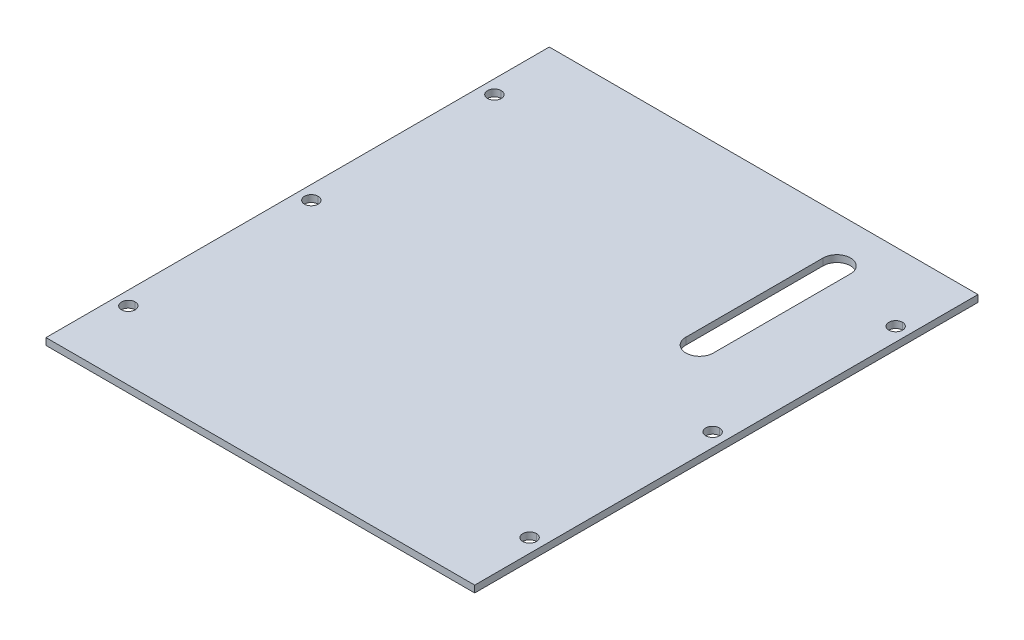
ISO-10303-21;
HEADER;
FILE_DESCRIPTION(('STEP AP214'),'2;1');
FILE_NAME('part.step','',(''),(''),'','','');
FILE_SCHEMA(('AUTOMOTIVE_DESIGN { 1 0 10303 214 1 1 1 1 }'));
ENDSEC;
DATA;
#1=APPLICATION_CONTEXT('core data for automotive mechanical design processes');
#2=APPLICATION_PROTOCOL_DEFINITION('international standard','automotive_design',2000,#1);
#3=PRODUCT_CONTEXT('',#1,'mechanical');
#4=PRODUCT('Part','Part','',(#3));
#5=PRODUCT_RELATED_PRODUCT_CATEGORY('part','',(#4));
#6=PRODUCT_DEFINITION_FORMATION('','',#4);
#7=PRODUCT_DEFINITION_CONTEXT('part definition',#1,'design');
#8=PRODUCT_DEFINITION('design','',#6,#7);
#9=PRODUCT_DEFINITION_SHAPE('','',#8);
#10=(LENGTH_UNIT() NAMED_UNIT(*) SI_UNIT(.MILLI.,.METRE.));
#11=(NAMED_UNIT(*) PLANE_ANGLE_UNIT() SI_UNIT($,.RADIAN.));
#12=(NAMED_UNIT(*) SI_UNIT($,.STERADIAN.) SOLID_ANGLE_UNIT());
#13=UNCERTAINTY_MEASURE_WITH_UNIT(LENGTH_MEASURE(1.E-05),#10,'distance_accuracy_value','');
#14=(GEOMETRIC_REPRESENTATION_CONTEXT(3) GLOBAL_UNCERTAINTY_ASSIGNED_CONTEXT((#13)) GLOBAL_UNIT_ASSIGNED_CONTEXT((#10,
#11,#12)) REPRESENTATION_CONTEXT('',''));
#15=CARTESIAN_POINT('',(0.,0.,0.));
#16=DIRECTION('',(0.,0.,1.));
#17=DIRECTION('',(1.,0.,0.));
#18=AXIS2_PLACEMENT_3D('',#15,#16,#17);
#19=CARTESIAN_POINT('',(69.85,-0.000999999999999916,-100.));
#20=DIRECTION('',(-1.,0.,0.));
#21=DIRECTION('',(0.,1.,0.));
#22=AXIS2_PLACEMENT_3D('',#19,#20,#21);
#23=PLANE('',#22);
#24=DIRECTION('',(0.,1.,0.));
#25=VECTOR('',#24,1.);
#26=CARTESIAN_POINT('',(69.85,-0.000999999999999916,-100.));
#27=LINE('',#26,#25);
#28=CARTESIAN_POINT('',(69.85,0.,-100.));
#29=VERTEX_POINT('',#28);
#30=CARTESIAN_POINT('',(69.85,1.5,-100.));
#31=VERTEX_POINT('',#30);
#32=EDGE_CURVE('E26',#29,#31,#27,.T.);
#33=ORIENTED_EDGE('',*,*,#32,.T.);
#34=DIRECTION('',(0.,0.,1.));
#35=VECTOR('',#34,1.);
#36=CARTESIAN_POINT('',(69.85,1.5,-100.));
#37=LINE('',#36,#35);
#38=CARTESIAN_POINT('',(69.85,1.5,-70.));
#39=VERTEX_POINT('',#38);
#40=EDGE_CURVE('E364',#31,#39,#37,.T.);
#41=ORIENTED_EDGE('',*,*,#40,.T.);
#42=DIRECTION('',(0.,1.,0.));
#43=VECTOR('',#42,1.);
#44=CARTESIAN_POINT('',(69.85,-0.000999999999999916,-70.));
#45=LINE('',#44,#43);
#46=CARTESIAN_POINT('',(69.85,0.,-70.));
#47=VERTEX_POINT('',#46);
#48=EDGE_CURVE('E11',#47,#39,#45,.T.);
#49=ORIENTED_EDGE('',*,*,#48,.F.);
#50=DIRECTION('',(0.,0.,1.));
#51=VECTOR('',#50,1.);
#52=CARTESIAN_POINT('',(69.85,0.,-100.));
#53=LINE('',#52,#51);
#54=EDGE_CURVE('E218',#29,#47,#53,.T.);
#55=ORIENTED_EDGE('',*,*,#54,.F.);
#56=EDGE_LOOP('',(#33,#41,#49,#55));
#57=FACE_BOUND('',#56,.T.);
#58=ADVANCED_FACE('F17',(#57),#23,.F.);
#59=CARTESIAN_POINT('',(72.85,-0.000999999999999916,-70.));
#60=DIRECTION('',(0.,1.,0.));
#61=DIRECTION('',(0.,0.,1.));
#62=AXIS2_PLACEMENT_3D('',#59,#60,#61);
#63=CYLINDRICAL_SURFACE('',#62,3.);
#64=DIRECTION('',(0.,1.,0.));
#65=VECTOR('',#64,1.);
#66=CARTESIAN_POINT('',(72.85,-0.000999999999999916,-67.));
#67=LINE('',#66,#65);
#68=CARTESIAN_POINT('',(72.85,0.,-67.));
#69=VERTEX_POINT('',#68);
#70=CARTESIAN_POINT('',(72.85,1.5,-67.));
#71=VERTEX_POINT('',#70);
#72=EDGE_CURVE('E224',#69,#71,#67,.T.);
#73=ORIENTED_EDGE('',*,*,#72,.F.);
#74=CARTESIAN_POINT('',(72.85,0.,-70.));
#75=DIRECTION('',(0.,1.,0.));
#76=DIRECTION('',(0.,0.,-1.));
#77=AXIS2_PLACEMENT_3D('',#74,#75,#76);
#78=CIRCLE('',#77,3.);
#79=EDGE_CURVE('E210',#47,#69,#78,.T.);
#80=ORIENTED_EDGE('',*,*,#79,.F.);
#81=ORIENTED_EDGE('',*,*,#48,.T.);
#82=CARTESIAN_POINT('',(72.85,1.5,-70.));
#83=DIRECTION('',(0.,1.,0.));
#84=DIRECTION('',(0.,0.,1.));
#85=AXIS2_PLACEMENT_3D('',#82,#83,#84);
#86=CIRCLE('',#85,3.);
#87=EDGE_CURVE('E227',#39,#71,#86,.T.);
#88=ORIENTED_EDGE('',*,*,#87,.T.);
#89=EDGE_LOOP('',(#73,#80,#81,#88));
#90=FACE_BOUND('',#89,.T.);
#91=ADVANCED_FACE('F225',(#90),#63,.F.);
#92=CARTESIAN_POINT('',(75.85,-0.000999999999999916,-100.));
#93=DIRECTION('',(1.,0.,0.));
#94=DIRECTION('',(0.,1.,0.));
#95=AXIS2_PLACEMENT_3D('',#92,#93,#94);
#96=PLANE('',#95);
#97=DIRECTION('',(0.,1.,0.));
#98=VECTOR('',#97,1.);
#99=CARTESIAN_POINT('',(75.85,-0.000999999999999916,-70.));
#100=LINE('',#99,#98);
#101=CARTESIAN_POINT('',(75.85,0.,-70.));
#102=VERTEX_POINT('',#101);
#103=CARTESIAN_POINT('',(75.85,1.5,-70.));
#104=VERTEX_POINT('',#103);
#105=EDGE_CURVE('E237',#102,#104,#100,.T.);
#106=ORIENTED_EDGE('',*,*,#105,.T.);
#107=DIRECTION('',(0.,0.,-1.));
#108=VECTOR('',#107,1.);
#109=CARTESIAN_POINT('',(75.85,1.5,-100.));
#110=LINE('',#109,#108);
#111=CARTESIAN_POINT('',(75.85,1.5,-100.));
#112=VERTEX_POINT('',#111);
#113=EDGE_CURVE('E382',#104,#112,#110,.T.);
#114=ORIENTED_EDGE('',*,*,#113,.T.);
#115=DIRECTION('',(0.,1.,0.));
#116=VECTOR('',#115,1.);
#117=CARTESIAN_POINT('',(75.85,-0.000999999999999916,-100.));
#118=LINE('',#117,#116);
#119=CARTESIAN_POINT('',(75.85,0.,-100.));
#120=VERTEX_POINT('',#119);
#121=EDGE_CURVE('E20',#120,#112,#118,.T.);
#122=ORIENTED_EDGE('',*,*,#121,.F.);
#123=DIRECTION('',(0.,0.,-1.));
#124=VECTOR('',#123,1.);
#125=CARTESIAN_POINT('',(75.85,0.,-100.));
#126=LINE('',#125,#124);
#127=EDGE_CURVE('E221',#102,#120,#126,.T.);
#128=ORIENTED_EDGE('',*,*,#127,.F.);
#129=EDGE_LOOP('',(#106,#114,#122,#128));
#130=FACE_BOUND('',#129,.T.);
#131=ADVANCED_FACE('F457',(#130),#96,.F.);
#132=CARTESIAN_POINT('',(72.85,-0.000999999999999916,-100.));
#133=DIRECTION('',(0.,1.,0.));
#134=DIRECTION('',(0.,0.,1.));
#135=AXIS2_PLACEMENT_3D('',#132,#133,#134);
#136=CYLINDRICAL_SURFACE('',#135,3.);
#137=ORIENTED_EDGE('',*,*,#121,.T.);
#138=CARTESIAN_POINT('',(72.85,1.5,-100.));
#139=DIRECTION('',(0.,1.,0.));
#140=DIRECTION('',(0.,0.,1.));
#141=AXIS2_PLACEMENT_3D('',#138,#139,#140);
#142=CIRCLE('',#141,3.);
#143=EDGE_CURVE('E367',#112,#31,#142,.T.);
#144=ORIENTED_EDGE('',*,*,#143,.T.);
#145=ORIENTED_EDGE('',*,*,#32,.F.);
#146=CARTESIAN_POINT('',(72.85,0.,-100.));
#147=DIRECTION('',(0.,1.,0.));
#148=DIRECTION('',(0.,0.,-1.));
#149=AXIS2_PLACEMENT_3D('',#146,#147,#148);
#150=CIRCLE('',#149,3.);
#151=EDGE_CURVE('E431',#120,#29,#150,.T.);
#152=ORIENTED_EDGE('',*,*,#151,.F.);
#153=EDGE_LOOP('',(#137,#144,#145,#152));
#154=FACE_BOUND('',#153,.T.);
#155=ADVANCED_FACE('F453',(#154),#136,.F.);
#156=CARTESIAN_POINT('',(3.,-0.000999999999999916,-95.));
#157=DIRECTION('',(0.,1.,0.));
#158=DIRECTION('',(0.,0.,1.));
#159=AXIS2_PLACEMENT_3D('',#156,#157,#158);
#160=CYLINDRICAL_SURFACE('',#159,1.5);
#161=DIRECTION('',(0.,1.,0.));
#162=VECTOR('',#161,1.);
#163=CARTESIAN_POINT('',(3.,-0.000999999999999916,-96.5));
#164=LINE('',#163,#162);
#165=CARTESIAN_POINT('',(3.,0.,-96.5));
#166=VERTEX_POINT('',#165);
#167=CARTESIAN_POINT('',(3.,1.5,-96.5));
#168=VERTEX_POINT('',#167);
#169=EDGE_CURVE('E271',#166,#168,#164,.T.);
#170=ORIENTED_EDGE('',*,*,#169,.F.);
#171=CARTESIAN_POINT('',(3.,0.,-95.));
#172=DIRECTION('',(0.,1.,0.));
#173=DIRECTION('',(0.,0.,-1.));
#174=AXIS2_PLACEMENT_3D('',#171,#172,#173);
#175=CIRCLE('',#174,1.5);
#176=CARTESIAN_POINT('',(3.,0.,-93.5));
#177=VERTEX_POINT('',#176);
#178=EDGE_CURVE('E302',#177,#166,#175,.T.);
#179=ORIENTED_EDGE('',*,*,#178,.F.);
#180=DIRECTION('',(0.,1.,0.));
#181=VECTOR('',#180,1.);
#182=CARTESIAN_POINT('',(3.,-0.000999999999999916,-93.5));
#183=LINE('',#182,#181);
#184=CARTESIAN_POINT('',(3.,1.5,-93.5));
#185=VERTEX_POINT('',#184);
#186=EDGE_CURVE('E257',#177,#185,#183,.T.);
#187=ORIENTED_EDGE('',*,*,#186,.T.);
#188=CARTESIAN_POINT('',(3.,1.5,-95.));
#189=DIRECTION('',(0.,1.,0.));
#190=DIRECTION('',(0.,0.,-1.));
#191=AXIS2_PLACEMENT_3D('',#188,#189,#190);
#192=CIRCLE('',#191,1.5);
#193=EDGE_CURVE('E340',#185,#168,#192,.T.);
#194=ORIENTED_EDGE('',*,*,#193,.T.);
#195=EDGE_LOOP('',(#170,#179,#187,#194));
#196=FACE_BOUND('',#195,.T.);
#197=ADVANCED_FACE('F473',(#196),#160,.F.);
#198=CARTESIAN_POINT('',(3.,-0.000999999999999916,-55.));
#199=DIRECTION('',(0.,1.,0.));
#200=DIRECTION('',(0.,0.,1.));
#201=AXIS2_PLACEMENT_3D('',#198,#199,#200);
#202=CYLINDRICAL_SURFACE('',#201,1.5);
#203=DIRECTION('',(0.,1.,0.));
#204=VECTOR('',#203,1.);
#205=CARTESIAN_POINT('',(3.,-0.000999999999999916,-56.5));
#206=LINE('',#205,#204);
#207=CARTESIAN_POINT('',(3.,0.,-56.5));
#208=VERTEX_POINT('',#207);
#209=CARTESIAN_POINT('',(3.,1.5,-56.5));
#210=VERTEX_POINT('',#209);
#211=EDGE_CURVE('E284',#208,#210,#206,.T.);
#212=ORIENTED_EDGE('',*,*,#211,.F.);
#213=CARTESIAN_POINT('',(3.,0.,-55.));
#214=DIRECTION('',(0.,1.,0.));
#215=DIRECTION('',(0.,0.,-1.));
#216=AXIS2_PLACEMENT_3D('',#213,#214,#215);
#217=CIRCLE('',#216,1.5);
#218=CARTESIAN_POINT('',(3.,0.,-53.5));
#219=VERTEX_POINT('',#218);
#220=EDGE_CURVE('E305',#219,#208,#217,.T.);
#221=ORIENTED_EDGE('',*,*,#220,.F.);
#222=DIRECTION('',(0.,1.,0.));
#223=VECTOR('',#222,1.);
#224=CARTESIAN_POINT('',(3.,-0.000999999999999916,-53.5));
#225=LINE('',#224,#223);
#226=CARTESIAN_POINT('',(3.,1.5,-53.5));
#227=VERTEX_POINT('',#226);
#228=EDGE_CURVE('E244',#219,#227,#225,.T.);
#229=ORIENTED_EDGE('',*,*,#228,.T.);
#230=CARTESIAN_POINT('',(3.,1.5,-55.));
#231=DIRECTION('',(0.,1.,0.));
#232=DIRECTION('',(0.,0.,-1.));
#233=AXIS2_PLACEMENT_3D('',#230,#231,#232);
#234=CIRCLE('',#233,1.5);
#235=EDGE_CURVE('E337',#227,#210,#234,.T.);
#236=ORIENTED_EDGE('',*,*,#235,.T.);
#237=EDGE_LOOP('',(#212,#221,#229,#236));
#238=FACE_BOUND('',#237,.T.);
#239=ADVANCED_FACE('F476',(#238),#202,.F.);
#240=CARTESIAN_POINT('',(3.,-0.000999999999999916,-15.));
#241=DIRECTION('',(0.,1.,0.));
#242=DIRECTION('',(0.,0.,1.));
#243=AXIS2_PLACEMENT_3D('',#240,#241,#242);
#244=CYLINDRICAL_SURFACE('',#243,1.5);
#245=DIRECTION('',(0.,1.,0.));
#246=VECTOR('',#245,1.);
#247=CARTESIAN_POINT('',(3.,-0.000999999999999916,-16.5));
#248=LINE('',#247,#246);
#249=CARTESIAN_POINT('',(3.,0.,-16.5));
#250=VERTEX_POINT('',#249);
#251=CARTESIAN_POINT('',(3.,1.5,-16.5));
#252=VERTEX_POINT('',#251);
#253=EDGE_CURVE('E301',#250,#252,#248,.T.);
#254=ORIENTED_EDGE('',*,*,#253,.F.);
#255=CARTESIAN_POINT('',(3.,0.,-15.));
#256=DIRECTION('',(0.,1.,0.));
#257=DIRECTION('',(0.,0.,-1.));
#258=AXIS2_PLACEMENT_3D('',#255,#256,#257);
#259=CIRCLE('',#258,1.5);
#260=CARTESIAN_POINT('',(3.,0.,-13.5));
#261=VERTEX_POINT('',#260);
#262=EDGE_CURVE('E292',#261,#250,#259,.T.);
#263=ORIENTED_EDGE('',*,*,#262,.F.);
#264=DIRECTION('',(0.,1.,0.));
#265=VECTOR('',#264,1.);
#266=CARTESIAN_POINT('',(3.,-0.000999999999999916,-13.5));
#267=LINE('',#266,#265);
#268=CARTESIAN_POINT('',(3.,1.5,-13.5));
#269=VERTEX_POINT('',#268);
#270=EDGE_CURVE('E300',#261,#269,#267,.T.);
#271=ORIENTED_EDGE('',*,*,#270,.T.);
#272=CARTESIAN_POINT('',(3.,1.5,-15.));
#273=DIRECTION('',(0.,1.,0.));
#274=DIRECTION('',(0.,0.,-1.));
#275=AXIS2_PLACEMENT_3D('',#272,#273,#274);
#276=CIRCLE('',#275,1.5);
#277=EDGE_CURVE('E267',#269,#252,#276,.T.);
#278=ORIENTED_EDGE('',*,*,#277,.T.);
#279=EDGE_LOOP('',(#254,#263,#271,#278));
#280=FACE_BOUND('',#279,.T.);
#281=ADVANCED_FACE('F480',(#280),#244,.F.);
#282=CARTESIAN_POINT('',(90.7,-0.000999999999999916,-15.));
#283=DIRECTION('',(0.,1.,0.));
#284=DIRECTION('',(0.,0.,1.));
#285=AXIS2_PLACEMENT_3D('',#282,#283,#284);
#286=CYLINDRICAL_SURFACE('',#285,1.5);
#287=DIRECTION('',(0.,1.,0.));
#288=VECTOR('',#287,1.);
#289=CARTESIAN_POINT('',(90.7,-0.000999999999999916,-16.5));
#290=LINE('',#289,#288);
#291=CARTESIAN_POINT('',(90.7,0.,-16.5));
#292=VERTEX_POINT('',#291);
#293=CARTESIAN_POINT('',(90.7,1.5,-16.5));
#294=VERTEX_POINT('',#293);
#295=EDGE_CURVE('E328',#292,#294,#290,.T.);
#296=ORIENTED_EDGE('',*,*,#295,.F.);
#297=CARTESIAN_POINT('',(90.7,0.,-15.));
#298=DIRECTION('',(0.,1.,0.));
#299=DIRECTION('',(0.,0.,-1.));
#300=AXIS2_PLACEMENT_3D('',#297,#298,#299);
#301=CIRCLE('',#300,1.5);
#302=CARTESIAN_POINT('',(90.7,0.,-13.5));
#303=VERTEX_POINT('',#302);
#304=EDGE_CURVE('E288',#303,#292,#301,.T.);
#305=ORIENTED_EDGE('',*,*,#304,.F.);
#306=DIRECTION('',(0.,1.,0.));
#307=VECTOR('',#306,1.);
#308=CARTESIAN_POINT('',(90.7,-0.000999999999999916,-13.5));
#309=LINE('',#308,#307);
#310=CARTESIAN_POINT('',(90.7,1.5,-13.5));
#311=VERTEX_POINT('',#310);
#312=EDGE_CURVE('E349',#303,#311,#309,.T.);
#313=ORIENTED_EDGE('',*,*,#312,.T.);
#314=CARTESIAN_POINT('',(90.7,1.5,-15.));
#315=DIRECTION('',(0.,1.,0.));
#316=DIRECTION('',(0.,0.,1.));
#317=AXIS2_PLACEMENT_3D('',#314,#315,#316);
#318=CIRCLE('',#317,1.5);
#319=EDGE_CURVE('E263',#311,#294,#318,.T.);
#320=ORIENTED_EDGE('',*,*,#319,.T.);
#321=EDGE_LOOP('',(#296,#305,#313,#320));
#322=FACE_BOUND('',#321,.T.);
#323=ADVANCED_FACE('F484',(#322),#286,.F.);
#324=CARTESIAN_POINT('',(90.7,-0.000999999999999916,-55.));
#325=DIRECTION('',(0.,1.,0.));
#326=DIRECTION('',(0.,0.,1.));
#327=AXIS2_PLACEMENT_3D('',#324,#325,#326);
#328=CYLINDRICAL_SURFACE('',#327,1.5);
#329=DIRECTION('',(0.,1.,0.));
#330=VECTOR('',#329,1.);
#331=CARTESIAN_POINT('',(90.7,-0.000999999999999916,-56.5));
#332=LINE('',#331,#330);
#333=CARTESIAN_POINT('',(90.7,0.,-56.5));
#334=VERTEX_POINT('',#333);
#335=CARTESIAN_POINT('',(90.7,1.5,-56.5));
#336=VERTEX_POINT('',#335);
#337=EDGE_CURVE('E332',#334,#336,#332,.T.);
#338=ORIENTED_EDGE('',*,*,#337,.F.);
#339=CARTESIAN_POINT('',(90.7,0.,-55.));
#340=DIRECTION('',(0.,1.,0.));
#341=DIRECTION('',(0.,0.,-1.));
#342=AXIS2_PLACEMENT_3D('',#339,#340,#341);
#343=CIRCLE('',#342,1.5);
#344=CARTESIAN_POINT('',(90.7,0.,-53.5));
#345=VERTEX_POINT('',#344);
#346=EDGE_CURVE('E291',#345,#334,#343,.T.);
#347=ORIENTED_EDGE('',*,*,#346,.F.);
#348=DIRECTION('',(0.,1.,0.));
#349=VECTOR('',#348,1.);
#350=CARTESIAN_POINT('',(90.7,-0.000999999999999916,-53.5));
#351=LINE('',#350,#349);
#352=CARTESIAN_POINT('',(90.7,1.5,-53.5));
#353=VERTEX_POINT('',#352);
#354=EDGE_CURVE('E278',#345,#353,#351,.T.);
#355=ORIENTED_EDGE('',*,*,#354,.T.);
#356=CARTESIAN_POINT('',(90.7,1.5,-55.));
#357=DIRECTION('',(0.,1.,0.));
#358=DIRECTION('',(0.,0.,1.));
#359=AXIS2_PLACEMENT_3D('',#356,#357,#358);
#360=CIRCLE('',#359,1.5);
#361=EDGE_CURVE('E266',#353,#336,#360,.T.);
#362=ORIENTED_EDGE('',*,*,#361,.T.);
#363=EDGE_LOOP('',(#338,#347,#355,#362));
#364=FACE_BOUND('',#363,.T.);
#365=ADVANCED_FACE('F489',(#364),#328,.F.);
#366=CARTESIAN_POINT('',(90.7,-0.000999999999999916,-95.));
#367=DIRECTION('',(0.,1.,0.));
#368=DIRECTION('',(0.,0.,1.));
#369=AXIS2_PLACEMENT_3D('',#366,#367,#368);
#370=CYLINDRICAL_SURFACE('',#369,1.5);
#371=DIRECTION('',(0.,1.,0.));
#372=VECTOR('',#371,1.);
#373=CARTESIAN_POINT('',(90.7,-0.000999999999999916,-96.5));
#374=LINE('',#373,#372);
#375=CARTESIAN_POINT('',(90.7,0.,-96.5));
#376=VERTEX_POINT('',#375);
#377=CARTESIAN_POINT('',(90.7,1.5,-96.5));
#378=VERTEX_POINT('',#377);
#379=EDGE_CURVE('E363',#376,#378,#374,.T.);
#380=ORIENTED_EDGE('',*,*,#379,.F.);
#381=CARTESIAN_POINT('',(90.7,0.,-95.));
#382=DIRECTION('',(0.,1.,0.));
#383=DIRECTION('',(0.,0.,-1.));
#384=AXIS2_PLACEMENT_3D('',#381,#382,#383);
#385=CIRCLE('',#384,1.5);
#386=CARTESIAN_POINT('',(90.7,0.,-93.5));
#387=VERTEX_POINT('',#386);
#388=EDGE_CURVE('E444',#387,#376,#385,.T.);
#389=ORIENTED_EDGE('',*,*,#388,.F.);
#390=DIRECTION('',(0.,1.,0.));
#391=VECTOR('',#390,1.);
#392=CARTESIAN_POINT('',(90.7,-0.000999999999999916,-93.5));
#393=LINE('',#392,#391);
#394=CARTESIAN_POINT('',(90.7,1.5,-93.5));
#395=VERTEX_POINT('',#394);
#396=EDGE_CURVE('E315',#387,#395,#393,.T.);
#397=ORIENTED_EDGE('',*,*,#396,.T.);
#398=CARTESIAN_POINT('',(90.7,1.5,-95.));
#399=DIRECTION('',(0.,1.,0.));
#400=DIRECTION('',(0.,0.,1.));
#401=AXIS2_PLACEMENT_3D('',#398,#399,#400);
#402=CIRCLE('',#401,1.5);
#403=EDGE_CURVE('E396',#395,#378,#402,.T.);
#404=ORIENTED_EDGE('',*,*,#403,.T.);
#405=EDGE_LOOP('',(#380,#389,#397,#404));
#406=FACE_BOUND('',#405,.T.);
#407=ADVANCED_FACE('F486',(#406),#370,.F.);
#408=CARTESIAN_POINT('',(0.,0.,0.));
#409=DIRECTION('',(0.,-1.,0.));
#410=DIRECTION('',(0.,0.,-1.));
#411=AXIS2_PLACEMENT_3D('',#408,#409,#410);
#412=PLANE('',#411);
#413=ORIENTED_EDGE('',*,*,#388,.T.);
#414=CARTESIAN_POINT('',(90.7,0.,-95.));
#415=DIRECTION('',(0.,1.,0.));
#416=DIRECTION('',(0.,0.,-1.));
#417=AXIS2_PLACEMENT_3D('',#414,#415,#416);
#418=CIRCLE('',#417,1.5);
#419=EDGE_CURVE('E282',#376,#387,#418,.T.);
#420=ORIENTED_EDGE('',*,*,#419,.T.);
#421=EDGE_LOOP('',(#413,#420));
#422=FACE_BOUND('',#421,.T.);
#423=ORIENTED_EDGE('',*,*,#346,.T.);
#424=CARTESIAN_POINT('',(90.7,0.,-55.));
#425=DIRECTION('',(0.,1.,0.));
#426=DIRECTION('',(0.,0.,-1.));
#427=AXIS2_PLACEMENT_3D('',#424,#425,#426);
#428=CIRCLE('',#427,1.5);
#429=EDGE_CURVE('E353',#334,#345,#428,.T.);
#430=ORIENTED_EDGE('',*,*,#429,.T.);
#431=EDGE_LOOP('',(#423,#430));
#432=FACE_BOUND('',#431,.T.);
#433=ORIENTED_EDGE('',*,*,#304,.T.);
#434=CARTESIAN_POINT('',(90.7,0.,-15.));
#435=DIRECTION('',(0.,1.,0.));
#436=DIRECTION('',(0.,0.,-1.));
#437=AXIS2_PLACEMENT_3D('',#434,#435,#436);
#438=CIRCLE('',#437,1.5);
#439=EDGE_CURVE('E324',#292,#303,#438,.T.);
#440=ORIENTED_EDGE('',*,*,#439,.T.);
#441=EDGE_LOOP('',(#433,#440));
#442=FACE_BOUND('',#441,.T.);
#443=ORIENTED_EDGE('',*,*,#262,.T.);
#444=CARTESIAN_POINT('',(3.,0.,-15.));
#445=DIRECTION('',(0.,1.,0.));
#446=DIRECTION('',(0.,0.,-1.));
#447=AXIS2_PLACEMENT_3D('',#444,#445,#446);
#448=CIRCLE('',#447,1.5);
#449=EDGE_CURVE('E248',#250,#261,#448,.T.);
#450=ORIENTED_EDGE('',*,*,#449,.T.);
#451=EDGE_LOOP('',(#443,#450));
#452=FACE_BOUND('',#451,.T.);
#453=ORIENTED_EDGE('',*,*,#220,.T.);
#454=CARTESIAN_POINT('',(3.,0.,-55.));
#455=DIRECTION('',(0.,1.,0.));
#456=DIRECTION('',(0.,0.,-1.));
#457=AXIS2_PLACEMENT_3D('',#454,#455,#456);
#458=CIRCLE('',#457,1.5);
#459=EDGE_CURVE('E261',#208,#219,#458,.T.);
#460=ORIENTED_EDGE('',*,*,#459,.T.);
#461=EDGE_LOOP('',(#453,#460));
#462=FACE_BOUND('',#461,.T.);
#463=ORIENTED_EDGE('',*,*,#178,.T.);
#464=CARTESIAN_POINT('',(3.,0.,-95.));
#465=DIRECTION('',(0.,1.,0.));
#466=DIRECTION('',(0.,0.,-1.));
#467=AXIS2_PLACEMENT_3D('',#464,#465,#466);
#468=CIRCLE('',#467,1.5);
#469=EDGE_CURVE('E256',#166,#177,#468,.T.);
#470=ORIENTED_EDGE('',*,*,#469,.T.);
#471=EDGE_LOOP('',(#463,#470));
#472=FACE_BOUND('',#471,.T.);
#473=ORIENTED_EDGE('',*,*,#151,.T.);
#474=ORIENTED_EDGE('',*,*,#54,.T.);
#475=ORIENTED_EDGE('',*,*,#79,.T.);
#476=CARTESIAN_POINT('',(72.85,0.,-70.));
#477=DIRECTION('',(0.,1.,0.));
#478=DIRECTION('',(0.,0.,-1.));
#479=AXIS2_PLACEMENT_3D('',#476,#477,#478);
#480=CIRCLE('',#479,3.);
#481=EDGE_CURVE('E217',#69,#102,#480,.T.);
#482=ORIENTED_EDGE('',*,*,#481,.T.);
#483=ORIENTED_EDGE('',*,*,#127,.T.);
#484=EDGE_LOOP('',(#473,#474,#475,#482,#483));
#485=FACE_BOUND('',#484,.T.);
#486=DIRECTION('',(0.,0.,1.));
#487=VECTOR('',#486,1.);
#488=CARTESIAN_POINT('',(0.,0.,0.));
#489=LINE('',#488,#487);
#490=CARTESIAN_POINT('',(0.,0.,-110.));
#491=VERTEX_POINT('',#490);
#492=CARTESIAN_POINT('',(0.,0.,0.));
#493=VERTEX_POINT('',#492);
#494=EDGE_CURVE('E319',#491,#493,#489,.T.);
#495=ORIENTED_EDGE('',*,*,#494,.F.);
#496=DIRECTION('',(-1.,0.,0.));
#497=VECTOR('',#496,1.);
#498=CARTESIAN_POINT('',(0.,0.,-110.));
#499=LINE('',#498,#497);
#500=CARTESIAN_POINT('',(93.7,0.,-110.));
#501=VERTEX_POINT('',#500);
#502=EDGE_CURVE('E341',#501,#491,#499,.T.);
#503=ORIENTED_EDGE('',*,*,#502,.F.);
#504=DIRECTION('',(0.,0.,-1.));
#505=VECTOR('',#504,1.);
#506=CARTESIAN_POINT('',(93.7,0.,0.));
#507=LINE('',#506,#505);
#508=CARTESIAN_POINT('',(93.7,0.,0.));
#509=VERTEX_POINT('',#508);
#510=EDGE_CURVE('E409',#509,#501,#507,.T.);
#511=ORIENTED_EDGE('',*,*,#510,.F.);
#512=DIRECTION('',(1.,0.,0.));
#513=VECTOR('',#512,1.);
#514=CARTESIAN_POINT('',(0.,0.,0.));
#515=LINE('',#514,#513);
#516=EDGE_CURVE('E393',#493,#509,#515,.T.);
#517=ORIENTED_EDGE('',*,*,#516,.F.);
#518=EDGE_LOOP('',(#495,#503,#511,#517));
#519=FACE_BOUND('',#518,.T.);
#520=ADVANCED_FACE('F213',(#422,#432,#442,#452,#462,#472,#485,#519),#412,.T.);
#521=CARTESIAN_POINT('',(0.,1.5,0.));
#522=DIRECTION('',(0.,-1.,0.));
#523=DIRECTION('',(0.,0.,-1.));
#524=AXIS2_PLACEMENT_3D('',#521,#522,#523);
#525=PLANE('',#524);
#526=ORIENTED_EDGE('',*,*,#403,.F.);
#527=CARTESIAN_POINT('',(90.7,1.5,-95.));
#528=DIRECTION('',(0.,1.,0.));
#529=DIRECTION('',(0.,0.,1.));
#530=AXIS2_PLACEMENT_3D('',#527,#528,#529);
#531=CIRCLE('',#530,1.5);
#532=EDGE_CURVE('E320',#378,#395,#531,.T.);
#533=ORIENTED_EDGE('',*,*,#532,.F.);
#534=EDGE_LOOP('',(#526,#533));
#535=FACE_BOUND('',#534,.T.);
#536=ORIENTED_EDGE('',*,*,#361,.F.);
#537=CARTESIAN_POINT('',(90.7,1.5,-55.));
#538=DIRECTION('',(0.,1.,0.));
#539=DIRECTION('',(0.,0.,1.));
#540=AXIS2_PLACEMENT_3D('',#537,#538,#539);
#541=CIRCLE('',#540,1.5);
#542=EDGE_CURVE('E283',#336,#353,#541,.T.);
#543=ORIENTED_EDGE('',*,*,#542,.F.);
#544=EDGE_LOOP('',(#536,#543));
#545=FACE_BOUND('',#544,.T.);
#546=ORIENTED_EDGE('',*,*,#319,.F.);
#547=CARTESIAN_POINT('',(90.7,1.5,-15.));
#548=DIRECTION('',(0.,1.,0.));
#549=DIRECTION('',(0.,0.,1.));
#550=AXIS2_PLACEMENT_3D('',#547,#548,#549);
#551=CIRCLE('',#550,1.5);
#552=EDGE_CURVE('E336',#294,#311,#551,.T.);
#553=ORIENTED_EDGE('',*,*,#552,.F.);
#554=EDGE_LOOP('',(#546,#553));
#555=FACE_BOUND('',#554,.T.);
#556=ORIENTED_EDGE('',*,*,#277,.F.);
#557=CARTESIAN_POINT('',(3.,1.5,-15.));
#558=DIRECTION('',(0.,1.,0.));
#559=DIRECTION('',(0.,0.,-1.));
#560=AXIS2_PLACEMENT_3D('',#557,#558,#559);
#561=CIRCLE('',#560,1.5);
#562=EDGE_CURVE('E296',#252,#269,#561,.T.);
#563=ORIENTED_EDGE('',*,*,#562,.F.);
#564=EDGE_LOOP('',(#556,#563));
#565=FACE_BOUND('',#564,.T.);
#566=ORIENTED_EDGE('',*,*,#235,.F.);
#567=CARTESIAN_POINT('',(3.,1.5,-55.));
#568=DIRECTION('',(0.,1.,0.));
#569=DIRECTION('',(0.,0.,-1.));
#570=AXIS2_PLACEMENT_3D('',#567,#568,#569);
#571=CIRCLE('',#570,1.5);
#572=EDGE_CURVE('E249',#210,#227,#571,.T.);
#573=ORIENTED_EDGE('',*,*,#572,.F.);
#574=EDGE_LOOP('',(#566,#573));
#575=FACE_BOUND('',#574,.T.);
#576=ORIENTED_EDGE('',*,*,#193,.F.);
#577=CARTESIAN_POINT('',(3.,1.5,-95.));
#578=DIRECTION('',(0.,1.,0.));
#579=DIRECTION('',(0.,0.,-1.));
#580=AXIS2_PLACEMENT_3D('',#577,#578,#579);
#581=CIRCLE('',#580,1.5);
#582=EDGE_CURVE('E262',#168,#185,#581,.T.);
#583=ORIENTED_EDGE('',*,*,#582,.F.);
#584=EDGE_LOOP('',(#576,#583));
#585=FACE_BOUND('',#584,.T.);
#586=ORIENTED_EDGE('',*,*,#40,.F.);
#587=ORIENTED_EDGE('',*,*,#143,.F.);
#588=ORIENTED_EDGE('',*,*,#113,.F.);
#589=CARTESIAN_POINT('',(72.85,1.5,-70.));
#590=DIRECTION('',(0.,1.,0.));
#591=DIRECTION('',(0.,0.,1.));
#592=AXIS2_PLACEMENT_3D('',#589,#590,#591);
#593=CIRCLE('',#592,3.);
#594=EDGE_CURVE('E232',#71,#104,#593,.T.);
#595=ORIENTED_EDGE('',*,*,#594,.F.);
#596=ORIENTED_EDGE('',*,*,#87,.F.);
#597=EDGE_LOOP('',(#586,#587,#588,#595,#596));
#598=FACE_BOUND('',#597,.T.);
#599=DIRECTION('',(0.,0.,1.));
#600=VECTOR('',#599,1.);
#601=CARTESIAN_POINT('',(0.,1.5,0.));
#602=LINE('',#601,#600);
#603=CARTESIAN_POINT('',(0.,1.5,-110.));
#604=VERTEX_POINT('',#603);
#605=CARTESIAN_POINT('',(0.,1.5,0.));
#606=VERTEX_POINT('',#605);
#607=EDGE_CURVE('E381',#604,#606,#602,.T.);
#608=ORIENTED_EDGE('',*,*,#607,.T.);
#609=DIRECTION('',(1.,0.,0.));
#610=VECTOR('',#609,1.);
#611=CARTESIAN_POINT('',(0.,1.5,0.));
#612=LINE('',#611,#610);
#613=CARTESIAN_POINT('',(93.7,1.5,0.));
#614=VERTEX_POINT('',#613);
#615=EDGE_CURVE('E404',#606,#614,#612,.T.);
#616=ORIENTED_EDGE('',*,*,#615,.T.);
#617=DIRECTION('',(0.,0.,-1.));
#618=VECTOR('',#617,1.);
#619=CARTESIAN_POINT('',(93.7,1.5,0.));
#620=LINE('',#619,#618);
#621=CARTESIAN_POINT('',(93.7,1.5,-110.));
#622=VERTEX_POINT('',#621);
#623=EDGE_CURVE('E345',#614,#622,#620,.T.);
#624=ORIENTED_EDGE('',*,*,#623,.T.);
#625=DIRECTION('',(-1.,0.,0.));
#626=VECTOR('',#625,1.);
#627=CARTESIAN_POINT('',(0.,1.5,-110.));
#628=LINE('',#627,#626);
#629=EDGE_CURVE('E344',#622,#604,#628,.T.);
#630=ORIENTED_EDGE('',*,*,#629,.T.);
#631=EDGE_LOOP('',(#608,#616,#624,#630));
#632=FACE_BOUND('',#631,.T.);
#633=ADVANCED_FACE('F459',(#535,#545,#555,#565,#575,#585,#598,#632),#525,.F.);
#634=CARTESIAN_POINT('',(0.,1.5,-110.));
#635=DIRECTION('',(0.,0.,1.));
#636=DIRECTION('',(1.,0.,0.));
#637=AXIS2_PLACEMENT_3D('',#634,#635,#636);
#638=PLANE('',#637);
#639=ORIENTED_EDGE('',*,*,#502,.T.);
#640=DIRECTION('',(0.,-1.,0.));
#641=VECTOR('',#640,1.);
#642=CARTESIAN_POINT('',(0.,1.5,-110.));
#643=LINE('',#642,#641);
#644=EDGE_CURVE('E389',#604,#491,#643,.T.);
#645=ORIENTED_EDGE('',*,*,#644,.F.);
#646=ORIENTED_EDGE('',*,*,#629,.F.);
#647=DIRECTION('',(0.,-1.,0.));
#648=VECTOR('',#647,1.);
#649=CARTESIAN_POINT('',(93.7,1.5,-110.));
#650=LINE('',#649,#648);
#651=EDGE_CURVE('E405',#622,#501,#650,.T.);
#652=ORIENTED_EDGE('',*,*,#651,.T.);
#653=EDGE_LOOP('',(#639,#645,#646,#652));
#654=FACE_BOUND('',#653,.T.);
#655=ADVANCED_FACE('F491',(#654),#638,.F.);
#656=CARTESIAN_POINT('',(93.7,1.5,0.));
#657=DIRECTION('',(-1.,0.,0.));
#658=DIRECTION('',(0.,0.,1.));
#659=AXIS2_PLACEMENT_3D('',#656,#657,#658);
#660=PLANE('',#659);
#661=ORIENTED_EDGE('',*,*,#510,.T.);
#662=ORIENTED_EDGE('',*,*,#651,.F.);
#663=ORIENTED_EDGE('',*,*,#623,.F.);
#664=DIRECTION('',(0.,-1.,0.));
#665=VECTOR('',#664,1.);
#666=CARTESIAN_POINT('',(93.7,1.5,0.));
#667=LINE('',#666,#665);
#668=EDGE_CURVE('E400',#614,#509,#667,.T.);
#669=ORIENTED_EDGE('',*,*,#668,.T.);
#670=EDGE_LOOP('',(#661,#662,#663,#669));
#671=FACE_BOUND('',#670,.T.);
#672=ADVANCED_FACE('F494',(#671),#660,.F.);
#673=CARTESIAN_POINT('',(0.,1.5,0.));
#674=DIRECTION('',(0.,0.,-1.));
#675=DIRECTION('',(0.,-1.,0.));
#676=AXIS2_PLACEMENT_3D('',#673,#674,#675);
#677=PLANE('',#676);
#678=ORIENTED_EDGE('',*,*,#516,.T.);
#679=ORIENTED_EDGE('',*,*,#668,.F.);
#680=ORIENTED_EDGE('',*,*,#615,.F.);
#681=DIRECTION('',(0.,-1.,0.));
#682=VECTOR('',#681,1.);
#683=CARTESIAN_POINT('',(0.,1.5,0.));
#684=LINE('',#683,#682);
#685=EDGE_CURVE('E377',#606,#493,#684,.T.);
#686=ORIENTED_EDGE('',*,*,#685,.T.);
#687=EDGE_LOOP('',(#678,#679,#680,#686));
#688=FACE_BOUND('',#687,.T.);
#689=ADVANCED_FACE('F496',(#688),#677,.F.);
#690=CARTESIAN_POINT('',(0.,1.5,0.));
#691=DIRECTION('',(1.,0.,0.));
#692=DIRECTION('',(0.,1.,0.));
#693=AXIS2_PLACEMENT_3D('',#690,#691,#692);
#694=PLANE('',#693);
#695=ORIENTED_EDGE('',*,*,#494,.T.);
#696=ORIENTED_EDGE('',*,*,#685,.F.);
#697=ORIENTED_EDGE('',*,*,#607,.F.);
#698=ORIENTED_EDGE('',*,*,#644,.T.);
#699=EDGE_LOOP('',(#695,#696,#697,#698));
#700=FACE_BOUND('',#699,.T.);
#701=ADVANCED_FACE('F499',(#700),#694,.F.);
#702=CARTESIAN_POINT('',(90.7,-0.000999999999999916,-95.));
#703=DIRECTION('',(0.,1.,0.));
#704=DIRECTION('',(0.,0.,1.));
#705=AXIS2_PLACEMENT_3D('',#702,#703,#704);
#706=CYLINDRICAL_SURFACE('',#705,1.5);
#707=ORIENTED_EDGE('',*,*,#419,.F.);
#708=ORIENTED_EDGE('',*,*,#379,.T.);
#709=ORIENTED_EDGE('',*,*,#532,.T.);
#710=ORIENTED_EDGE('',*,*,#396,.F.);
#711=EDGE_LOOP('',(#707,#708,#709,#710));
#712=FACE_BOUND('',#711,.T.);
#713=ADVANCED_FACE('F501',(#712),#706,.F.);
#714=CARTESIAN_POINT('',(90.7,-0.000999999999999916,-55.));
#715=DIRECTION('',(0.,1.,0.));
#716=DIRECTION('',(0.,0.,1.));
#717=AXIS2_PLACEMENT_3D('',#714,#715,#716);
#718=CYLINDRICAL_SURFACE('',#717,1.5);
#719=ORIENTED_EDGE('',*,*,#429,.F.);
#720=ORIENTED_EDGE('',*,*,#337,.T.);
#721=ORIENTED_EDGE('',*,*,#542,.T.);
#722=ORIENTED_EDGE('',*,*,#354,.F.);
#723=EDGE_LOOP('',(#719,#720,#721,#722));
#724=FACE_BOUND('',#723,.T.);
#725=ADVANCED_FACE('F504',(#724),#718,.F.);
#726=CARTESIAN_POINT('',(90.7,-0.000999999999999916,-15.));
#727=DIRECTION('',(0.,1.,0.));
#728=DIRECTION('',(0.,0.,1.));
#729=AXIS2_PLACEMENT_3D('',#726,#727,#728);
#730=CYLINDRICAL_SURFACE('',#729,1.5);
#731=ORIENTED_EDGE('',*,*,#439,.F.);
#732=ORIENTED_EDGE('',*,*,#295,.T.);
#733=ORIENTED_EDGE('',*,*,#552,.T.);
#734=ORIENTED_EDGE('',*,*,#312,.F.);
#735=EDGE_LOOP('',(#731,#732,#733,#734));
#736=FACE_BOUND('',#735,.T.);
#737=ADVANCED_FACE('F509',(#736),#730,.F.);
#738=CARTESIAN_POINT('',(3.,-0.000999999999999916,-15.));
#739=DIRECTION('',(0.,1.,0.));
#740=DIRECTION('',(0.,0.,1.));
#741=AXIS2_PLACEMENT_3D('',#738,#739,#740);
#742=CYLINDRICAL_SURFACE('',#741,1.5);
#743=ORIENTED_EDGE('',*,*,#449,.F.);
#744=ORIENTED_EDGE('',*,*,#253,.T.);
#745=ORIENTED_EDGE('',*,*,#562,.T.);
#746=ORIENTED_EDGE('',*,*,#270,.F.);
#747=EDGE_LOOP('',(#743,#744,#745,#746));
#748=FACE_BOUND('',#747,.T.);
#749=ADVANCED_FACE('F512',(#748),#742,.F.);
#750=CARTESIAN_POINT('',(3.,-0.000999999999999916,-55.));
#751=DIRECTION('',(0.,1.,0.));
#752=DIRECTION('',(0.,0.,1.));
#753=AXIS2_PLACEMENT_3D('',#750,#751,#752);
#754=CYLINDRICAL_SURFACE('',#753,1.5);
#755=ORIENTED_EDGE('',*,*,#459,.F.);
#756=ORIENTED_EDGE('',*,*,#211,.T.);
#757=ORIENTED_EDGE('',*,*,#572,.T.);
#758=ORIENTED_EDGE('',*,*,#228,.F.);
#759=EDGE_LOOP('',(#755,#756,#757,#758));
#760=FACE_BOUND('',#759,.T.);
#761=ADVANCED_FACE('F518',(#760),#754,.F.);
#762=CARTESIAN_POINT('',(3.,-0.000999999999999916,-95.));
#763=DIRECTION('',(0.,1.,0.));
#764=DIRECTION('',(0.,0.,1.));
#765=AXIS2_PLACEMENT_3D('',#762,#763,#764);
#766=CYLINDRICAL_SURFACE('',#765,1.5);
#767=ORIENTED_EDGE('',*,*,#469,.F.);
#768=ORIENTED_EDGE('',*,*,#169,.T.);
#769=ORIENTED_EDGE('',*,*,#582,.T.);
#770=ORIENTED_EDGE('',*,*,#186,.F.);
#771=EDGE_LOOP('',(#767,#768,#769,#770));
#772=FACE_BOUND('',#771,.T.);
#773=ADVANCED_FACE('F522',(#772),#766,.F.);
#774=CARTESIAN_POINT('',(72.85,-0.000999999999999916,-70.));
#775=DIRECTION('',(0.,1.,0.));
#776=DIRECTION('',(0.,0.,1.));
#777=AXIS2_PLACEMENT_3D('',#774,#775,#776);
#778=CYLINDRICAL_SURFACE('',#777,3.);
#779=ORIENTED_EDGE('',*,*,#481,.F.);
#780=ORIENTED_EDGE('',*,*,#72,.T.);
#781=ORIENTED_EDGE('',*,*,#594,.T.);
#782=ORIENTED_EDGE('',*,*,#105,.F.);
#783=EDGE_LOOP('',(#779,#780,#781,#782));
#784=FACE_BOUND('',#783,.T.);
#785=ADVANCED_FACE('F235',(#784),#778,.F.);
#786=CLOSED_SHELL('',(#58,#91,#131,#155,#197,#239,#281,#323,#365,#407,#520,#633,#655,#672,#689,
#701,#713,#725,#737,#749,#761,#773,#785));
#787=MANIFOLD_SOLID_BREP('B1',#786);
#788=ADVANCED_BREP_SHAPE_REPRESENTATION('',(#18,#787),#14);
#789=SHAPE_DEFINITION_REPRESENTATION(#9,#788);
ENDSEC;
END-ISO-10303-21;
